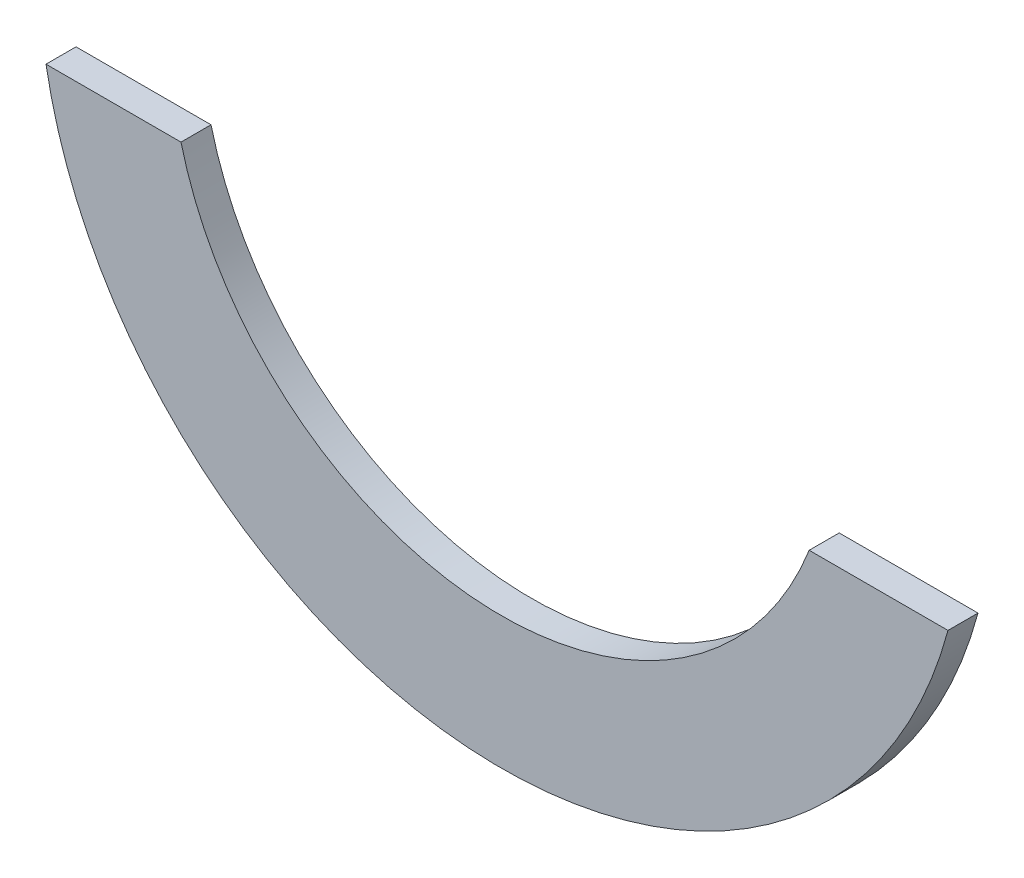
ISO-10303-21;
HEADER;
FILE_DESCRIPTION(('STEP AP214'),'2;1');
FILE_NAME('part.step','',(''),(''),'','','');
FILE_SCHEMA(('AUTOMOTIVE_DESIGN { 1 0 10303 214 1 1 1 1 }'));
ENDSEC;
DATA;
#1=APPLICATION_CONTEXT('core data for automotive mechanical design processes');
#2=APPLICATION_PROTOCOL_DEFINITION('international standard','automotive_design',2000,#1);
#3=PRODUCT_CONTEXT('',#1,'mechanical');
#4=PRODUCT('Part','Part','',(#3));
#5=PRODUCT_RELATED_PRODUCT_CATEGORY('part','',(#4));
#6=PRODUCT_DEFINITION_FORMATION('','',#4);
#7=PRODUCT_DEFINITION_CONTEXT('part definition',#1,'design');
#8=PRODUCT_DEFINITION('design','',#6,#7);
#9=PRODUCT_DEFINITION_SHAPE('','',#8);
#10=(LENGTH_UNIT() NAMED_UNIT(*) SI_UNIT(.MILLI.,.METRE.));
#11=(NAMED_UNIT(*) PLANE_ANGLE_UNIT() SI_UNIT($,.RADIAN.));
#12=(NAMED_UNIT(*) SI_UNIT($,.STERADIAN.) SOLID_ANGLE_UNIT());
#13=UNCERTAINTY_MEASURE_WITH_UNIT(LENGTH_MEASURE(1.E-05),#10,'distance_accuracy_value','');
#14=(GEOMETRIC_REPRESENTATION_CONTEXT(3) GLOBAL_UNCERTAINTY_ASSIGNED_CONTEXT((#13)) GLOBAL_UNIT_ASSIGNED_CONTEXT((#10,
#11,#12)) REPRESENTATION_CONTEXT('',''));
#15=CARTESIAN_POINT('',(0.,0.,0.));
#16=DIRECTION('',(0.,0.,1.));
#17=DIRECTION('',(1.,0.,0.));
#18=AXIS2_PLACEMENT_3D('',#15,#16,#17);
#19=CARTESIAN_POINT('',(0.,0.,2.5));
#20=DIRECTION('',(0.,0.,-1.));
#21=DIRECTION('',(-1.,0.,0.));
#22=AXIS2_PLACEMENT_3D('',#19,#20,#21);
#23=CYLINDRICAL_SURFACE('',#22,55.);
#24=CARTESIAN_POINT('',(0.,0.,-2.5));
#25=DIRECTION('',(0.,0.,-1.));
#26=DIRECTION('',(1.,0.,0.));
#27=AXIS2_PLACEMENT_3D('',#24,#25,#26);
#28=CIRCLE('',#27,55.);
#29=CARTESIAN_POINT('',(51.2623868886241,-19.9290664728939,-2.5));
#30=VERTEX_POINT('',#29);
#31=CARTESIAN_POINT('',(-53.3499650826487,-13.3709096803534,-2.5));
#32=VERTEX_POINT('',#31);
#33=EDGE_CURVE('E95',#30,#32,#28,.T.);
#34=ORIENTED_EDGE('',*,*,#33,.T.);
#35=DIRECTION('',(0.,0.,-1.));
#36=VECTOR('',#35,1.);
#37=CARTESIAN_POINT('',(-53.3499650826487,-13.3709096803534,2.5));
#38=LINE('',#37,#36);
#39=CARTESIAN_POINT('',(-53.3499650826487,-13.3709096803534,2.5));
#40=VERTEX_POINT('',#39);
#41=EDGE_CURVE('E11',#40,#32,#38,.T.);
#42=ORIENTED_EDGE('',*,*,#41,.F.);
#43=CARTESIAN_POINT('',(0.,0.,2.5));
#44=DIRECTION('',(0.,0.,-1.));
#45=DIRECTION('',(1.,0.,0.));
#46=AXIS2_PLACEMENT_3D('',#43,#44,#45);
#47=CIRCLE('',#46,55.);
#48=CARTESIAN_POINT('',(51.2623868886241,-19.9290664728939,2.5));
#49=VERTEX_POINT('',#48);
#50=EDGE_CURVE('E83',#49,#40,#47,.T.);
#51=ORIENTED_EDGE('',*,*,#50,.F.);
#52=DIRECTION('',(0.,0.,-1.));
#53=VECTOR('',#52,1.);
#54=CARTESIAN_POINT('',(51.2623868886241,-19.9290664728939,2.5));
#55=LINE('',#54,#53);
#56=EDGE_CURVE('E91',#49,#30,#55,.T.);
#57=ORIENTED_EDGE('',*,*,#56,.T.);
#58=EDGE_LOOP('',(#34,#42,#51,#57));
#59=FACE_BOUND('',#58,.T.);
#60=ADVANCED_FACE('F32',(#59),#23,.F.);
#61=CARTESIAN_POINT('',(-75.8301969819401,-13.3709096803534,2.5));
#62=DIRECTION('',(0.,-1.,0.));
#63=DIRECTION('',(0.,0.,-1.));
#64=AXIS2_PLACEMENT_3D('',#61,#62,#63);
#65=PLANE('',#64);
#66=DIRECTION('',(-1.,0.,0.));
#67=VECTOR('',#66,1.);
#68=CARTESIAN_POINT('',(-75.8301969819401,-13.3709096803534,-2.5));
#69=LINE('',#68,#67);
#70=CARTESIAN_POINT('',(-75.8301969819401,-13.3709096803534,-2.5));
#71=VERTEX_POINT('',#70);
#72=EDGE_CURVE('E87',#32,#71,#69,.T.);
#73=ORIENTED_EDGE('',*,*,#72,.T.);
#74=DIRECTION('',(0.,0.,-1.));
#75=VECTOR('',#74,1.);
#76=CARTESIAN_POINT('',(-75.8301969819401,-13.3709096803534,2.5));
#77=LINE('',#76,#75);
#78=CARTESIAN_POINT('',(-75.8301969819401,-13.3709096803534,2.5));
#79=VERTEX_POINT('',#78);
#80=EDGE_CURVE('E40',#79,#71,#77,.T.);
#81=ORIENTED_EDGE('',*,*,#80,.F.);
#82=DIRECTION('',(-1.,0.,0.));
#83=VECTOR('',#82,1.);
#84=CARTESIAN_POINT('',(-75.8301969819401,-13.3709096803534,2.5));
#85=LINE('',#84,#83);
#86=EDGE_CURVE('E78',#40,#79,#85,.T.);
#87=ORIENTED_EDGE('',*,*,#86,.F.);
#88=ORIENTED_EDGE('',*,*,#41,.T.);
#89=EDGE_LOOP('',(#73,#81,#87,#88));
#90=FACE_BOUND('',#89,.T.);
#91=ADVANCED_FACE('F86',(#90),#65,.F.);
#92=CARTESIAN_POINT('',(0.,0.,2.5));
#93=DIRECTION('',(0.,0.,-1.));
#94=DIRECTION('',(-1.,0.,0.));
#95=AXIS2_PLACEMENT_3D('',#92,#93,#94);
#96=CYLINDRICAL_SURFACE('',#95,77.);
#97=CARTESIAN_POINT('',(0.,0.,-2.5));
#98=DIRECTION('',(0.,0.,1.));
#99=DIRECTION('',(1.,0.,0.));
#100=AXIS2_PLACEMENT_3D('',#97,#98,#99);
#101=CIRCLE('',#100,77.);
#102=CARTESIAN_POINT('',(74.3762886242583,-19.9290664728939,-2.5));
#103=VERTEX_POINT('',#102);
#104=EDGE_CURVE('E65',#71,#103,#101,.T.);
#105=ORIENTED_EDGE('',*,*,#104,.T.);
#106=DIRECTION('',(0.,0.,-1.));
#107=VECTOR('',#106,1.);
#108=CARTESIAN_POINT('',(74.3762886242583,-19.9290664728939,2.5));
#109=LINE('',#108,#107);
#110=CARTESIAN_POINT('',(74.3762886242583,-19.9290664728939,2.5));
#111=VERTEX_POINT('',#110);
#112=EDGE_CURVE('E88',#111,#103,#109,.T.);
#113=ORIENTED_EDGE('',*,*,#112,.F.);
#114=CARTESIAN_POINT('',(0.,0.,2.5));
#115=DIRECTION('',(0.,0.,1.));
#116=DIRECTION('',(1.,0.,0.));
#117=AXIS2_PLACEMENT_3D('',#114,#115,#116);
#118=CIRCLE('',#117,77.);
#119=EDGE_CURVE('E81',#79,#111,#118,.T.);
#120=ORIENTED_EDGE('',*,*,#119,.F.);
#121=ORIENTED_EDGE('',*,*,#80,.T.);
#122=EDGE_LOOP('',(#105,#113,#120,#121));
#123=FACE_BOUND('',#122,.T.);
#124=ADVANCED_FACE('F89',(#123),#96,.T.);
#125=CARTESIAN_POINT('',(74.3762886242583,-19.9290664728939,2.5));
#126=DIRECTION('',(0.,-1.,0.));
#127=DIRECTION('',(1.,0.,0.));
#128=AXIS2_PLACEMENT_3D('',#125,#126,#127);
#129=PLANE('',#128);
#130=DIRECTION('',(-1.,0.,0.));
#131=VECTOR('',#130,1.);
#132=CARTESIAN_POINT('',(74.3762886242583,-19.9290664728939,-2.5));
#133=LINE('',#132,#131);
#134=EDGE_CURVE('E71',#103,#30,#133,.T.);
#135=ORIENTED_EDGE('',*,*,#134,.T.);
#136=ORIENTED_EDGE('',*,*,#56,.F.);
#137=DIRECTION('',(-1.,0.,0.));
#138=VECTOR('',#137,1.);
#139=CARTESIAN_POINT('',(74.3762886242583,-19.9290664728939,2.5));
#140=LINE('',#139,#138);
#141=EDGE_CURVE('E48',#111,#49,#140,.T.);
#142=ORIENTED_EDGE('',*,*,#141,.F.);
#143=ORIENTED_EDGE('',*,*,#112,.T.);
#144=EDGE_LOOP('',(#135,#136,#142,#143));
#145=FACE_BOUND('',#144,.T.);
#146=ADVANCED_FACE('F102',(#145),#129,.F.);
#147=CARTESIAN_POINT('',(0.,0.,2.5));
#148=DIRECTION('',(0.,0.,1.));
#149=DIRECTION('',(1.,0.,0.));
#150=AXIS2_PLACEMENT_3D('',#147,#148,#149);
#151=PLANE('',#150);
#152=ORIENTED_EDGE('',*,*,#50,.T.);
#153=ORIENTED_EDGE('',*,*,#86,.T.);
#154=ORIENTED_EDGE('',*,*,#119,.T.);
#155=ORIENTED_EDGE('',*,*,#141,.T.);
#156=EDGE_LOOP('',(#152,#153,#154,#155));
#157=FACE_BOUND('',#156,.T.);
#158=ADVANCED_FACE('F79',(#157),#151,.T.);
#159=CARTESIAN_POINT('',(0.,0.,-2.5));
#160=DIRECTION('',(0.,0.,1.));
#161=DIRECTION('',(1.,0.,0.));
#162=AXIS2_PLACEMENT_3D('',#159,#160,#161);
#163=PLANE('',#162);
#164=ORIENTED_EDGE('',*,*,#33,.F.);
#165=ORIENTED_EDGE('',*,*,#134,.F.);
#166=ORIENTED_EDGE('',*,*,#104,.F.);
#167=ORIENTED_EDGE('',*,*,#72,.F.);
#168=EDGE_LOOP('',(#164,#165,#166,#167));
#169=FACE_BOUND('',#168,.T.);
#170=ADVANCED_FACE('F105',(#169),#163,.F.);
#171=CLOSED_SHELL('',(#60,#91,#124,#146,#158,#170));
#172=MANIFOLD_SOLID_BREP('B2',#171);
#173=ADVANCED_BREP_SHAPE_REPRESENTATION('',(#18,#172),#14);
#174=SHAPE_DEFINITION_REPRESENTATION(#9,#173);
ENDSEC;
END-ISO-10303-21;
